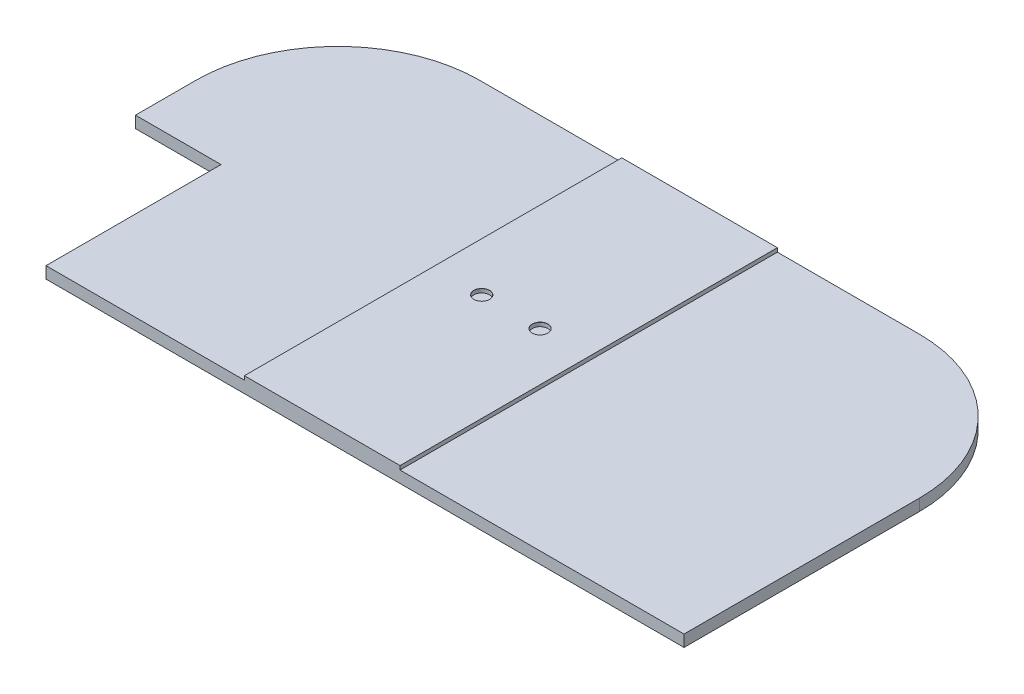
ISO-10303-21;
HEADER;
FILE_DESCRIPTION(('STEP AP214'),'2;1');
FILE_NAME('part.step','',(''),(''),'','','');
FILE_SCHEMA(('AUTOMOTIVE_DESIGN { 1 0 10303 214 1 1 1 1 }'));
ENDSEC;
DATA;
#1=APPLICATION_CONTEXT('core data for automotive mechanical design processes');
#2=APPLICATION_PROTOCOL_DEFINITION('international standard','automotive_design',2000,#1);
#3=PRODUCT_CONTEXT('',#1,'mechanical');
#4=PRODUCT('Part','Part','',(#3));
#5=PRODUCT_RELATED_PRODUCT_CATEGORY('part','',(#4));
#6=PRODUCT_DEFINITION_FORMATION('','',#4);
#7=PRODUCT_DEFINITION_CONTEXT('part definition',#1,'design');
#8=PRODUCT_DEFINITION('design','',#6,#7);
#9=PRODUCT_DEFINITION_SHAPE('','',#8);
#10=(LENGTH_UNIT() NAMED_UNIT(*) SI_UNIT(.MILLI.,.METRE.));
#11=(NAMED_UNIT(*) PLANE_ANGLE_UNIT() SI_UNIT($,.RADIAN.));
#12=(NAMED_UNIT(*) SI_UNIT($,.STERADIAN.) SOLID_ANGLE_UNIT());
#13=UNCERTAINTY_MEASURE_WITH_UNIT(LENGTH_MEASURE(1.E-05),#10,'distance_accuracy_value','');
#14=(GEOMETRIC_REPRESENTATION_CONTEXT(3) GLOBAL_UNCERTAINTY_ASSIGNED_CONTEXT((#13)) GLOBAL_UNIT_ASSIGNED_CONTEXT((#10,
#11,#12)) REPRESENTATION_CONTEXT('',''));
#15=CARTESIAN_POINT('',(0.,0.,0.));
#16=DIRECTION('',(0.,0.,1.));
#17=DIRECTION('',(1.,0.,0.));
#18=AXIS2_PLACEMENT_3D('',#15,#16,#17);
#19=CARTESIAN_POINT('',(-20.,1.,48.5));
#20=DIRECTION('',(1.,0.,0.));
#21=DIRECTION('',(0.,0.,-1.));
#22=AXIS2_PLACEMENT_3D('',#19,#20,#21);
#23=PLANE('',#22);
#24=DIRECTION('',(0.,0.,1.));
#25=VECTOR('',#24,1.);
#26=CARTESIAN_POINT('',(-20.,0.,48.5));
#27=LINE('',#26,#25);
#28=CARTESIAN_POINT('',(-20.,0.,-48.5));
#29=VERTEX_POINT('',#28);
#30=CARTESIAN_POINT('',(-20.,0.,48.5));
#31=VERTEX_POINT('',#30);
#32=EDGE_CURVE('E182',#29,#31,#27,.T.);
#33=ORIENTED_EDGE('',*,*,#32,.T.);
#34=DIRECTION('',(0.,-1.,0.));
#35=VECTOR('',#34,1.);
#36=CARTESIAN_POINT('',(-20.,1.,48.5));
#37=LINE('',#36,#35);
#38=CARTESIAN_POINT('',(-20.,1.,48.5));
#39=VERTEX_POINT('',#38);
#40=EDGE_CURVE('E206',#39,#31,#37,.T.);
#41=ORIENTED_EDGE('',*,*,#40,.F.);
#42=DIRECTION('',(0.,0.,1.));
#43=VECTOR('',#42,1.);
#44=CARTESIAN_POINT('',(-20.,1.,48.5));
#45=LINE('',#44,#43);
#46=CARTESIAN_POINT('',(-20.,1.,-48.5));
#47=VERTEX_POINT('',#46);
#48=EDGE_CURVE('E183',#47,#39,#45,.T.);
#49=ORIENTED_EDGE('',*,*,#48,.F.);
#50=DIRECTION('',(0.,-1.,0.));
#51=VECTOR('',#50,1.);
#52=CARTESIAN_POINT('',(-20.,1.,-48.5));
#53=LINE('',#52,#51);
#54=EDGE_CURVE('E193',#47,#29,#53,.T.);
#55=ORIENTED_EDGE('',*,*,#54,.T.);
#56=EDGE_LOOP('',(#33,#41,#49,#55));
#57=FACE_BOUND('',#56,.T.);
#58=ADVANCED_FACE('F34',(#57),#23,.F.);
#59=CARTESIAN_POINT('',(20.,1.,48.5));
#60=DIRECTION('',(0.,0.,-1.));
#61=DIRECTION('',(-1.,0.,0.));
#62=AXIS2_PLACEMENT_3D('',#59,#60,#61);
#63=PLANE('',#62);
#64=DIRECTION('',(1.,0.,0.));
#65=VECTOR('',#64,1.);
#66=CARTESIAN_POINT('',(0.,0.,48.5));
#67=LINE('',#66,#65);
#68=CARTESIAN_POINT('',(-71.,0.,48.5));
#69=VERTEX_POINT('',#68);
#70=EDGE_CURVE('E138',#69,#31,#67,.T.);
#71=ORIENTED_EDGE('',*,*,#70,.F.);
#72=DIRECTION('',(0.,1.,0.));
#73=VECTOR('',#72,1.);
#74=CARTESIAN_POINT('',(-71.,-3.,48.5));
#75=LINE('',#74,#73);
#76=CARTESIAN_POINT('',(-71.,-3.,48.5));
#77=VERTEX_POINT('',#76);
#78=EDGE_CURVE('E49',#77,#69,#75,.T.);
#79=ORIENTED_EDGE('',*,*,#78,.F.);
#80=DIRECTION('',(1.,0.,0.));
#81=VECTOR('',#80,1.);
#82=CARTESIAN_POINT('',(0.,-3.,48.5));
#83=LINE('',#82,#81);
#84=CARTESIAN_POINT('',(93.,-3.,48.5));
#85=VERTEX_POINT('',#84);
#86=EDGE_CURVE('E135',#77,#85,#83,.T.);
#87=ORIENTED_EDGE('',*,*,#86,.T.);
#88=DIRECTION('',(0.,1.,0.));
#89=VECTOR('',#88,1.);
#90=CARTESIAN_POINT('',(93.,-3.,48.5));
#91=LINE('',#90,#89);
#92=CARTESIAN_POINT('',(93.,0.,48.5));
#93=VERTEX_POINT('',#92);
#94=EDGE_CURVE('E146',#85,#93,#91,.T.);
#95=ORIENTED_EDGE('',*,*,#94,.T.);
#96=CARTESIAN_POINT('',(20.,0.,48.5));
#97=VERTEX_POINT('',#96);
#98=EDGE_CURVE('E158',#97,#93,#67,.T.);
#99=ORIENTED_EDGE('',*,*,#98,.F.);
#100=DIRECTION('',(0.,-1.,0.));
#101=VECTOR('',#100,1.);
#102=CARTESIAN_POINT('',(20.,1.,48.5));
#103=LINE('',#102,#101);
#104=CARTESIAN_POINT('',(20.,1.,48.5));
#105=VERTEX_POINT('',#104);
#106=EDGE_CURVE('E203',#105,#97,#103,.T.);
#107=ORIENTED_EDGE('',*,*,#106,.F.);
#108=DIRECTION('',(1.,0.,0.));
#109=VECTOR('',#108,1.);
#110=CARTESIAN_POINT('',(20.,1.,48.5));
#111=LINE('',#110,#109);
#112=EDGE_CURVE('E186',#39,#105,#111,.T.);
#113=ORIENTED_EDGE('',*,*,#112,.F.);
#114=ORIENTED_EDGE('',*,*,#40,.T.);
#115=EDGE_LOOP('',(#71,#79,#87,#95,#99,#107,#113,#114));
#116=FACE_BOUND('',#115,.T.);
#117=ADVANCED_FACE('F133',(#116),#63,.F.);
#118=CARTESIAN_POINT('',(20.,1.,48.5));
#119=DIRECTION('',(-1.,0.,0.));
#120=DIRECTION('',(0.,0.,1.));
#121=AXIS2_PLACEMENT_3D('',#118,#119,#120);
#122=PLANE('',#121);
#123=DIRECTION('',(0.,0.,-1.));
#124=VECTOR('',#123,1.);
#125=CARTESIAN_POINT('',(20.,0.,48.5));
#126=LINE('',#125,#124);
#127=CARTESIAN_POINT('',(20.,0.,-48.5));
#128=VERTEX_POINT('',#127);
#129=EDGE_CURVE('E187',#97,#128,#126,.T.);
#130=ORIENTED_EDGE('',*,*,#129,.T.);
#131=DIRECTION('',(0.,-1.,0.));
#132=VECTOR('',#131,1.);
#133=CARTESIAN_POINT('',(20.,1.,-48.5));
#134=LINE('',#133,#132);
#135=CARTESIAN_POINT('',(20.,1.,-48.5));
#136=VERTEX_POINT('',#135);
#137=EDGE_CURVE('E200',#136,#128,#134,.T.);
#138=ORIENTED_EDGE('',*,*,#137,.F.);
#139=DIRECTION('',(0.,0.,-1.));
#140=VECTOR('',#139,1.);
#141=CARTESIAN_POINT('',(20.,1.,48.5));
#142=LINE('',#141,#140);
#143=EDGE_CURVE('E189',#105,#136,#142,.T.);
#144=ORIENTED_EDGE('',*,*,#143,.F.);
#145=ORIENTED_EDGE('',*,*,#106,.T.);
#146=EDGE_LOOP('',(#130,#138,#144,#145));
#147=FACE_BOUND('',#146,.T.);
#148=ADVANCED_FACE('F241',(#147),#122,.F.);
#149=CARTESIAN_POINT('',(20.,1.,-48.5));
#150=DIRECTION('',(0.,0.,1.));
#151=DIRECTION('',(1.,0.,0.));
#152=AXIS2_PLACEMENT_3D('',#149,#150,#151);
#153=PLANE('',#152);
#154=DIRECTION('',(-1.,0.,0.));
#155=VECTOR('',#154,1.);
#156=CARTESIAN_POINT('',(0.,0.,-48.5));
#157=LINE('',#156,#155);
#158=CARTESIAN_POINT('',(56.5,0.,-48.5));
#159=VERTEX_POINT('',#158);
#160=EDGE_CURVE('E153',#159,#128,#157,.T.);
#161=ORIENTED_EDGE('',*,*,#160,.F.);
#162=DIRECTION('',(0.,1.,0.));
#163=VECTOR('',#162,1.);
#164=CARTESIAN_POINT('',(56.5,-3.,-48.5));
#165=LINE('',#164,#163);
#166=CARTESIAN_POINT('',(56.5,-3.,-48.5));
#167=VERTEX_POINT('',#166);
#168=EDGE_CURVE('E216',#159,#167,#165,.F.);
#169=ORIENTED_EDGE('',*,*,#168,.T.);
#170=DIRECTION('',(-1.,0.,0.));
#171=VECTOR('',#170,1.);
#172=CARTESIAN_POINT('',(0.,-3.,-48.5));
#173=LINE('',#172,#171);
#174=CARTESIAN_POINT('',(-56.5,-3.,-48.5));
#175=VERTEX_POINT('',#174);
#176=EDGE_CURVE('E149',#167,#175,#173,.T.);
#177=ORIENTED_EDGE('',*,*,#176,.T.);
#178=DIRECTION('',(0.,1.,0.));
#179=VECTOR('',#178,1.);
#180=CARTESIAN_POINT('',(-56.5,0.,-48.5));
#181=LINE('',#180,#179);
#182=CARTESIAN_POINT('',(-56.5,0.,-48.5));
#183=VERTEX_POINT('',#182);
#184=EDGE_CURVE('E213',#175,#183,#181,.T.);
#185=ORIENTED_EDGE('',*,*,#184,.T.);
#186=EDGE_CURVE('E156',#29,#183,#157,.T.);
#187=ORIENTED_EDGE('',*,*,#186,.F.);
#188=ORIENTED_EDGE('',*,*,#54,.F.);
#189=DIRECTION('',(-1.,0.,0.));
#190=VECTOR('',#189,1.);
#191=CARTESIAN_POINT('',(20.,1.,-48.5));
#192=LINE('',#191,#190);
#193=EDGE_CURVE('E191',#136,#47,#192,.T.);
#194=ORIENTED_EDGE('',*,*,#193,.F.);
#195=ORIENTED_EDGE('',*,*,#137,.T.);
#196=EDGE_LOOP('',(#161,#169,#177,#185,#187,#188,#194,#195));
#197=FACE_BOUND('',#196,.T.);
#198=ADVANCED_FACE('F235',(#197),#153,.F.);
#199=CARTESIAN_POINT('',(0.,1.,0.));
#200=DIRECTION('',(0.,1.,0.));
#201=DIRECTION('',(0.,0.,1.));
#202=AXIS2_PLACEMENT_3D('',#199,#200,#201);
#203=PLANE('',#202);
#204=CARTESIAN_POINT('',(7.5,1.,0.));
#205=DIRECTION('',(0.,1.,0.));
#206=DIRECTION('',(0.,0.,1.));
#207=AXIS2_PLACEMENT_3D('',#204,#205,#206);
#208=CIRCLE('',#207,2.025);
#209=CARTESIAN_POINT('',(7.5,1.,2.025));
#210=VERTEX_POINT('',#209);
#211=EDGE_CURVE('E164',#210,#210,#208,.T.);
#212=ORIENTED_EDGE('',*,*,#211,.F.);
#213=EDGE_LOOP('',(#212));
#214=FACE_BOUND('',#213,.T.);
#215=CARTESIAN_POINT('',(-7.5,1.,0.));
#216=DIRECTION('',(0.,1.,0.));
#217=DIRECTION('',(0.,0.,1.));
#218=AXIS2_PLACEMENT_3D('',#215,#216,#217);
#219=CIRCLE('',#218,2.025);
#220=CARTESIAN_POINT('',(-7.5,1.,2.025));
#221=VERTEX_POINT('',#220);
#222=EDGE_CURVE('E173',#221,#221,#219,.T.);
#223=ORIENTED_EDGE('',*,*,#222,.F.);
#224=EDGE_LOOP('',(#223));
#225=FACE_BOUND('',#224,.T.);
#226=ORIENTED_EDGE('',*,*,#48,.T.);
#227=ORIENTED_EDGE('',*,*,#112,.T.);
#228=ORIENTED_EDGE('',*,*,#143,.T.);
#229=ORIENTED_EDGE('',*,*,#193,.T.);
#230=EDGE_LOOP('',(#226,#227,#228,#229));
#231=FACE_BOUND('',#230,.T.);
#232=ADVANCED_FACE('F247',(#214,#225,#231),#203,.T.);
#233=CARTESIAN_POINT('',(-7.5,1.,0.));
#234=DIRECTION('',(0.,1.,0.));
#235=DIRECTION('',(0.,0.,1.));
#236=AXIS2_PLACEMENT_3D('',#233,#234,#235);
#237=CYLINDRICAL_SURFACE('',#236,2.);
#238=CARTESIAN_POINT('',(-7.5,0.,0.));
#239=DIRECTION('',(0.,1.,0.));
#240=DIRECTION('',(0.,0.,1.));
#241=AXIS2_PLACEMENT_3D('',#238,#239,#240);
#242=CIRCLE('',#241,2.);
#243=CARTESIAN_POINT('',(-7.5,0.,2.));
#244=VERTEX_POINT('',#243);
#245=EDGE_CURVE('E179',#244,#244,#242,.T.);
#246=ORIENTED_EDGE('',*,*,#245,.F.);
#247=EDGE_LOOP('',(#246));
#248=FACE_BOUND('',#247,.T.);
#249=CARTESIAN_POINT('',(-7.5,0.974999999999999,0.));
#250=DIRECTION('',(0.,1.,0.));
#251=DIRECTION('',(0.,0.,1.));
#252=AXIS2_PLACEMENT_3D('',#249,#250,#251);
#253=CIRCLE('',#252,2.);
#254=CARTESIAN_POINT('',(-7.5,0.974999999999999,2.));
#255=VERTEX_POINT('',#254);
#256=EDGE_CURVE('E176',#255,#255,#253,.T.);
#257=ORIENTED_EDGE('',*,*,#256,.T.);
#258=EDGE_LOOP('',(#257));
#259=FACE_BOUND('',#258,.T.);
#260=ADVANCED_FACE('F320',(#248,#259),#237,.F.);
#261=CARTESIAN_POINT('',(-7.5,1.,0.));
#262=DIRECTION('',(0.,1.,0.));
#263=DIRECTION('',(0.,0.,1.));
#264=AXIS2_PLACEMENT_3D('',#261,#262,#263);
#265=CONICAL_SURFACE('',#264,2.025,0.785398163397448);
#266=ORIENTED_EDGE('',*,*,#256,.F.);
#267=EDGE_LOOP('',(#266));
#268=FACE_BOUND('',#267,.T.);
#269=ORIENTED_EDGE('',*,*,#222,.T.);
#270=EDGE_LOOP('',(#269));
#271=FACE_BOUND('',#270,.T.);
#272=ADVANCED_FACE('F316',(#268,#271),#265,.F.);
#273=CARTESIAN_POINT('',(7.5,1.,0.));
#274=DIRECTION('',(0.,1.,0.));
#275=DIRECTION('',(0.,0.,1.));
#276=AXIS2_PLACEMENT_3D('',#273,#274,#275);
#277=CYLINDRICAL_SURFACE('',#276,2.);
#278=CARTESIAN_POINT('',(7.5,0.,0.));
#279=DIRECTION('',(0.,1.,0.));
#280=DIRECTION('',(0.,0.,1.));
#281=AXIS2_PLACEMENT_3D('',#278,#279,#280);
#282=CIRCLE('',#281,2.);
#283=CARTESIAN_POINT('',(7.5,0.,2.));
#284=VERTEX_POINT('',#283);
#285=EDGE_CURVE('E170',#284,#284,#282,.T.);
#286=ORIENTED_EDGE('',*,*,#285,.F.);
#287=EDGE_LOOP('',(#286));
#288=FACE_BOUND('',#287,.T.);
#289=CARTESIAN_POINT('',(7.5,0.974999999999999,0.));
#290=DIRECTION('',(0.,1.,0.));
#291=DIRECTION('',(0.,0.,1.));
#292=AXIS2_PLACEMENT_3D('',#289,#290,#291);
#293=CIRCLE('',#292,2.);
#294=CARTESIAN_POINT('',(7.5,0.974999999999999,2.));
#295=VERTEX_POINT('',#294);
#296=EDGE_CURVE('E167',#295,#295,#293,.T.);
#297=ORIENTED_EDGE('',*,*,#296,.T.);
#298=EDGE_LOOP('',(#297));
#299=FACE_BOUND('',#298,.T.);
#300=ADVANCED_FACE('F312',(#288,#299),#277,.F.);
#301=CARTESIAN_POINT('',(7.5,1.,0.));
#302=DIRECTION('',(0.,1.,0.));
#303=DIRECTION('',(0.,0.,1.));
#304=AXIS2_PLACEMENT_3D('',#301,#302,#303);
#305=CONICAL_SURFACE('',#304,2.025,0.785398163397448);
#306=ORIENTED_EDGE('',*,*,#296,.F.);
#307=EDGE_LOOP('',(#306));
#308=FACE_BOUND('',#307,.T.);
#309=ORIENTED_EDGE('',*,*,#211,.T.);
#310=EDGE_LOOP('',(#309));
#311=FACE_BOUND('',#310,.T.);
#312=ADVANCED_FACE('F309',(#308,#311),#305,.F.);
#313=CARTESIAN_POINT('',(0.,-3.,0.));
#314=DIRECTION('',(0.,1.,0.));
#315=DIRECTION('',(0.,0.,1.));
#316=AXIS2_PLACEMENT_3D('',#313,#314,#315);
#317=PLANE('',#316);
#318=DIRECTION('',(0.,0.,-1.));
#319=VECTOR('',#318,1.);
#320=CARTESIAN_POINT('',(-71.,-3.,48.5));
#321=LINE('',#320,#319);
#322=CARTESIAN_POINT('',(-71.,-3.,3.49999999999998));
#323=VERTEX_POINT('',#322);
#324=EDGE_CURVE('E121',#77,#323,#321,.T.);
#325=ORIENTED_EDGE('',*,*,#324,.T.);
#326=DIRECTION('',(-1.,0.,0.));
#327=VECTOR('',#326,1.);
#328=CARTESIAN_POINT('',(-93.,-3.,3.49999999999998));
#329=LINE('',#328,#327);
#330=CARTESIAN_POINT('',(-93.,-3.,3.49999999999998));
#331=VERTEX_POINT('',#330);
#332=EDGE_CURVE('E128',#323,#331,#329,.T.);
#333=ORIENTED_EDGE('',*,*,#332,.T.);
#334=DIRECTION('',(0.,0.,1.));
#335=VECTOR('',#334,1.);
#336=CARTESIAN_POINT('',(-93.,-3.,0.));
#337=LINE('',#336,#335);
#338=CARTESIAN_POINT('',(-93.,-3.,-12.));
#339=VERTEX_POINT('',#338);
#340=EDGE_CURVE('E144',#339,#331,#337,.T.);
#341=ORIENTED_EDGE('',*,*,#340,.F.);
#342=CARTESIAN_POINT('',(-56.5,-3.,-12.));
#343=DIRECTION('',(0.,1.,0.));
#344=DIRECTION('',(0.,0.,1.));
#345=AXIS2_PLACEMENT_3D('',#342,#343,#344);
#346=CIRCLE('',#345,36.5);
#347=EDGE_CURVE('E218',#339,#175,#346,.F.);
#348=ORIENTED_EDGE('',*,*,#347,.T.);
#349=ORIENTED_EDGE('',*,*,#176,.F.);
#350=CARTESIAN_POINT('',(56.5,-3.,-12.));
#351=DIRECTION('',(0.,1.,0.));
#352=DIRECTION('',(0.,0.,1.));
#353=AXIS2_PLACEMENT_3D('',#350,#351,#352);
#354=CIRCLE('',#353,36.5);
#355=CARTESIAN_POINT('',(93.,-3.,-12.));
#356=VERTEX_POINT('',#355);
#357=EDGE_CURVE('E220',#167,#356,#354,.F.);
#358=ORIENTED_EDGE('',*,*,#357,.T.);
#359=DIRECTION('',(0.,0.,-1.));
#360=VECTOR('',#359,1.);
#361=CARTESIAN_POINT('',(93.,-3.,0.));
#362=LINE('',#361,#360);
#363=EDGE_CURVE('E143',#85,#356,#362,.T.);
#364=ORIENTED_EDGE('',*,*,#363,.F.);
#365=ORIENTED_EDGE('',*,*,#86,.F.);
#366=EDGE_LOOP('',(#325,#333,#341,#348,#349,#358,#364,#365));
#367=FACE_BOUND('',#366,.T.);
#368=ADVANCED_FACE('F141',(#367),#317,.F.);
#369=CARTESIAN_POINT('',(-93.,-3.,0.));
#370=DIRECTION('',(-1.,0.,0.));
#371=DIRECTION('',(0.,0.,1.));
#372=AXIS2_PLACEMENT_3D('',#369,#370,#371);
#373=PLANE('',#372);
#374=DIRECTION('',(0.,1.,0.));
#375=VECTOR('',#374,1.);
#376=CARTESIAN_POINT('',(-93.,-3.,3.49999999999998));
#377=LINE('',#376,#375);
#378=CARTESIAN_POINT('',(-93.,0.,3.49999999999998));
#379=VERTEX_POINT('',#378);
#380=EDGE_CURVE('E253',#331,#379,#377,.T.);
#381=ORIENTED_EDGE('',*,*,#380,.T.);
#382=DIRECTION('',(0.,0.,1.));
#383=VECTOR('',#382,1.);
#384=CARTESIAN_POINT('',(-93.,0.,0.));
#385=LINE('',#384,#383);
#386=CARTESIAN_POINT('',(-93.,0.,-12.));
#387=VERTEX_POINT('',#386);
#388=EDGE_CURVE('E155',#387,#379,#385,.T.);
#389=ORIENTED_EDGE('',*,*,#388,.F.);
#390=DIRECTION('',(0.,1.,0.));
#391=VECTOR('',#390,1.);
#392=CARTESIAN_POINT('',(-93.,-3.,-12.));
#393=LINE('',#392,#391);
#394=EDGE_CURVE('E11',#387,#339,#393,.F.);
#395=ORIENTED_EDGE('',*,*,#394,.T.);
#396=ORIENTED_EDGE('',*,*,#340,.T.);
#397=EDGE_LOOP('',(#381,#389,#395,#396));
#398=FACE_BOUND('',#397,.T.);
#399=ADVANCED_FACE('F264',(#398),#373,.T.);
#400=CARTESIAN_POINT('',(93.,-3.,0.));
#401=DIRECTION('',(1.,0.,0.));
#402=DIRECTION('',(0.,0.,-1.));
#403=AXIS2_PLACEMENT_3D('',#400,#401,#402);
#404=PLANE('',#403);
#405=ORIENTED_EDGE('',*,*,#363,.T.);
#406=DIRECTION('',(0.,1.,0.));
#407=VECTOR('',#406,1.);
#408=CARTESIAN_POINT('',(93.,0.,-12.));
#409=LINE('',#408,#407);
#410=CARTESIAN_POINT('',(93.,0.,-12.));
#411=VERTEX_POINT('',#410);
#412=EDGE_CURVE('E208',#356,#411,#409,.T.);
#413=ORIENTED_EDGE('',*,*,#412,.T.);
#414=DIRECTION('',(0.,0.,-1.));
#415=VECTOR('',#414,1.);
#416=CARTESIAN_POINT('',(93.,0.,0.));
#417=LINE('',#416,#415);
#418=EDGE_CURVE('E160',#93,#411,#417,.T.);
#419=ORIENTED_EDGE('',*,*,#418,.F.);
#420=ORIENTED_EDGE('',*,*,#94,.F.);
#421=EDGE_LOOP('',(#405,#413,#419,#420));
#422=FACE_BOUND('',#421,.T.);
#423=ADVANCED_FACE('F228',(#422),#404,.T.);
#424=CARTESIAN_POINT('',(0.,0.,0.));
#425=DIRECTION('',(0.,1.,0.));
#426=DIRECTION('',(0.,0.,1.));
#427=AXIS2_PLACEMENT_3D('',#424,#425,#426);
#428=PLANE('',#427);
#429=ORIENTED_EDGE('',*,*,#418,.T.);
#430=CARTESIAN_POINT('',(56.5,0.,-12.));
#431=DIRECTION('',(0.,1.,0.));
#432=DIRECTION('',(0.,0.,1.));
#433=AXIS2_PLACEMENT_3D('',#430,#431,#432);
#434=CIRCLE('',#433,36.5);
#435=EDGE_CURVE('E211',#411,#159,#434,.T.);
#436=ORIENTED_EDGE('',*,*,#435,.T.);
#437=ORIENTED_EDGE('',*,*,#160,.T.);
#438=ORIENTED_EDGE('',*,*,#129,.F.);
#439=ORIENTED_EDGE('',*,*,#98,.T.);
#440=EDGE_LOOP('',(#429,#436,#437,#438,#439));
#441=FACE_BOUND('',#440,.T.);
#442=ADVANCED_FACE('F233',(#441),#428,.T.);
#443=DIRECTION('',(-1.,0.,0.));
#444=VECTOR('',#443,1.);
#445=CARTESIAN_POINT('',(-93.,0.,3.49999999999998));
#446=LINE('',#445,#444);
#447=CARTESIAN_POINT('',(-71.,0.,3.49999999999998));
#448=VERTEX_POINT('',#447);
#449=EDGE_CURVE('E129',#448,#379,#446,.T.);
#450=ORIENTED_EDGE('',*,*,#449,.F.);
#451=DIRECTION('',(0.,0.,-1.));
#452=VECTOR('',#451,1.);
#453=CARTESIAN_POINT('',(-71.,0.,48.5));
#454=LINE('',#453,#452);
#455=EDGE_CURVE('E267',#69,#448,#454,.T.);
#456=ORIENTED_EDGE('',*,*,#455,.F.);
#457=ORIENTED_EDGE('',*,*,#70,.T.);
#458=ORIENTED_EDGE('',*,*,#32,.F.);
#459=ORIENTED_EDGE('',*,*,#186,.T.);
#460=CARTESIAN_POINT('',(-56.5,0.,-12.));
#461=DIRECTION('',(0.,1.,0.));
#462=DIRECTION('',(0.,0.,1.));
#463=AXIS2_PLACEMENT_3D('',#460,#461,#462);
#464=CIRCLE('',#463,36.5);
#465=EDGE_CURVE('E42',#183,#387,#464,.T.);
#466=ORIENTED_EDGE('',*,*,#465,.T.);
#467=ORIENTED_EDGE('',*,*,#388,.T.);
#468=EDGE_LOOP('',(#450,#456,#457,#458,#459,#466,#467));
#469=FACE_BOUND('',#468,.T.);
#470=ADVANCED_FACE('F251',(#469),#428,.T.);
#471=ORIENTED_EDGE('',*,*,#245,.T.);
#472=EDGE_LOOP('',(#471));
#473=FACE_BOUND('',#472,.T.);
#474=ADVANCED_FACE('F288',(#473),#428,.T.);
#475=ORIENTED_EDGE('',*,*,#285,.T.);
#476=EDGE_LOOP('',(#475));
#477=FACE_BOUND('',#476,.T.);
#478=ADVANCED_FACE('F284',(#477),#428,.T.);
#479=CARTESIAN_POINT('',(56.5,-3.,-12.));
#480=DIRECTION('',(0.,-1.,0.));
#481=DIRECTION('',(0.,0.,-1.));
#482=AXIS2_PLACEMENT_3D('',#479,#480,#481);
#483=CYLINDRICAL_SURFACE('',#482,36.5);
#484=ORIENTED_EDGE('',*,*,#357,.F.);
#485=ORIENTED_EDGE('',*,*,#168,.F.);
#486=ORIENTED_EDGE('',*,*,#435,.F.);
#487=ORIENTED_EDGE('',*,*,#412,.F.);
#488=EDGE_LOOP('',(#484,#485,#486,#487));
#489=FACE_BOUND('',#488,.T.);
#490=ADVANCED_FACE('F230',(#489),#483,.T.);
#491=CARTESIAN_POINT('',(-56.5,1.,-12.));
#492=DIRECTION('',(0.,-1.,0.));
#493=DIRECTION('',(0.,0.,-1.));
#494=AXIS2_PLACEMENT_3D('',#491,#492,#493);
#495=CYLINDRICAL_SURFACE('',#494,36.5);
#496=ORIENTED_EDGE('',*,*,#347,.F.);
#497=ORIENTED_EDGE('',*,*,#394,.F.);
#498=ORIENTED_EDGE('',*,*,#465,.F.);
#499=ORIENTED_EDGE('',*,*,#184,.F.);
#500=EDGE_LOOP('',(#496,#497,#498,#499));
#501=FACE_BOUND('',#500,.T.);
#502=ADVANCED_FACE('F36',(#501),#495,.T.);
#503=CARTESIAN_POINT('',(-93.,-3.,3.49999999999998));
#504=DIRECTION('',(0.,0.,-1.));
#505=DIRECTION('',(-1.,0.,0.));
#506=AXIS2_PLACEMENT_3D('',#503,#504,#505);
#507=PLANE('',#506);
#508=ORIENTED_EDGE('',*,*,#449,.T.);
#509=ORIENTED_EDGE('',*,*,#380,.F.);
#510=ORIENTED_EDGE('',*,*,#332,.F.);
#511=DIRECTION('',(0.,1.,0.));
#512=VECTOR('',#511,1.);
#513=CARTESIAN_POINT('',(-71.,-3.,3.49999999999998));
#514=LINE('',#513,#512);
#515=EDGE_CURVE('E123',#323,#448,#514,.T.);
#516=ORIENTED_EDGE('',*,*,#515,.T.);
#517=EDGE_LOOP('',(#508,#509,#510,#516));
#518=FACE_BOUND('',#517,.T.);
#519=ADVANCED_FACE('F268',(#518),#507,.F.);
#520=CARTESIAN_POINT('',(-71.,-3.,48.5));
#521=DIRECTION('',(1.,0.,0.));
#522=DIRECTION('',(0.,0.,-1.));
#523=AXIS2_PLACEMENT_3D('',#520,#521,#522);
#524=PLANE('',#523);
#525=ORIENTED_EDGE('',*,*,#455,.T.);
#526=ORIENTED_EDGE('',*,*,#515,.F.);
#527=ORIENTED_EDGE('',*,*,#324,.F.);
#528=ORIENTED_EDGE('',*,*,#78,.T.);
#529=EDGE_LOOP('',(#525,#526,#527,#528));
#530=FACE_BOUND('',#529,.T.);
#531=ADVANCED_FACE('F122',(#530),#524,.F.);
#532=CLOSED_SHELL('',(#58,#117,#148,#198,#232,#260,#272,#300,#312,#368,#399,#423,#442,#470,#474,
#478,#490,#502,#519,#531));
#533=MANIFOLD_SOLID_BREP('B2',#532);
#534=ADVANCED_BREP_SHAPE_REPRESENTATION('',(#18,#533),#14);
#535=SHAPE_DEFINITION_REPRESENTATION(#9,#534);
ENDSEC;
END-ISO-10303-21;
